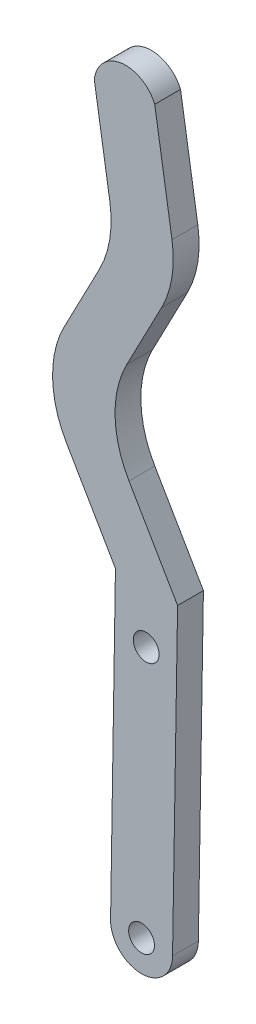
ISO-10303-21;
HEADER;
FILE_DESCRIPTION(('STEP AP214'),'2;1');
FILE_NAME('part.step','',(''),(''),'','','');
FILE_SCHEMA(('AUTOMOTIVE_DESIGN { 1 0 10303 214 1 1 1 1 }'));
ENDSEC;
DATA;
#1=APPLICATION_CONTEXT('core data for automotive mechanical design processes');
#2=APPLICATION_PROTOCOL_DEFINITION('international standard','automotive_design',2000,#1);
#3=PRODUCT_CONTEXT('',#1,'mechanical');
#4=PRODUCT('Part','Part','',(#3));
#5=PRODUCT_RELATED_PRODUCT_CATEGORY('part','',(#4));
#6=PRODUCT_DEFINITION_FORMATION('','',#4);
#7=PRODUCT_DEFINITION_CONTEXT('part definition',#1,'design');
#8=PRODUCT_DEFINITION('design','',#6,#7);
#9=PRODUCT_DEFINITION_SHAPE('','',#8);
#10=(LENGTH_UNIT() NAMED_UNIT(*) SI_UNIT(.MILLI.,.METRE.));
#11=(NAMED_UNIT(*) PLANE_ANGLE_UNIT() SI_UNIT($,.RADIAN.));
#12=(NAMED_UNIT(*) SI_UNIT($,.STERADIAN.) SOLID_ANGLE_UNIT());
#13=UNCERTAINTY_MEASURE_WITH_UNIT(LENGTH_MEASURE(1.E-05),#10,'distance_accuracy_value','');
#14=(GEOMETRIC_REPRESENTATION_CONTEXT(3) GLOBAL_UNCERTAINTY_ASSIGNED_CONTEXT((#13)) GLOBAL_UNIT_ASSIGNED_CONTEXT((#10,
#11,#12)) REPRESENTATION_CONTEXT('',''));
#15=CARTESIAN_POINT('',(0.,0.,0.));
#16=DIRECTION('',(0.,0.,1.));
#17=DIRECTION('',(1.,0.,0.));
#18=AXIS2_PLACEMENT_3D('',#15,#16,#17);
#19=CARTESIAN_POINT('',(2.76862014120037,85.7702329190452,5.));
#20=DIRECTION('',(0.,0.,1.));
#21=DIRECTION('',(1.,0.,0.));
#22=AXIS2_PLACEMENT_3D('',#19,#20,#21);
#23=PLANE('',#22);
#24=CARTESIAN_POINT('',(0.,-1.02524867935661E-13,5.));
#25=DIRECTION('',(0.,0.,1.));
#26=DIRECTION('',(1.,0.,0.));
#27=AXIS2_PLACEMENT_3D('',#24,#25,#26);
#28=CIRCLE('',#27,2.50000000000004);
#29=CARTESIAN_POINT('',(2.50000000000003,-1.02524867935661E-13,5.));
#30=VERTEX_POINT('',#29);
#31=EDGE_CURVE('E169',#30,#30,#28,.T.);
#32=ORIENTED_EDGE('',*,*,#31,.F.);
#33=EDGE_LOOP('',(#32));
#34=FACE_BOUND('',#33,.T.);
#35=DIRECTION('',(0.502736581634854,-0.864439662143114,0.));
#36=VECTOR('',#35,1.);
#37=CARTESIAN_POINT('',(-5.05699972133685,59.443873761078,5.));
#38=LINE('',#37,#36);
#39=CARTESIAN_POINT('',(-14.5201731016619,75.7155012863481,5.));
#40=VERTEX_POINT('',#39);
#41=CARTESIAN_POINT('',(-5.05699972133685,59.443873761078,5.));
#42=VERTEX_POINT('',#41);
#43=EDGE_CURVE('E192',#40,#42,#38,.T.);
#44=ORIENTED_EDGE('',*,*,#43,.T.);
#45=DIRECTION('',(-0.015859987864443,-0.999874222482478,0.));
#46=VECTOR('',#45,1.);
#47=CARTESIAN_POINT('',(-5.99677971324759,0.196552971949537,5.));
#48=LINE('',#47,#46);
#49=CARTESIAN_POINT('',(-5.99677971324759,0.196552971949537,5.));
#50=VERTEX_POINT('',#49);
#51=EDGE_CURVE('E110',#42,#50,#48,.T.);
#52=ORIENTED_EDGE('',*,*,#51,.T.);
#53=CARTESIAN_POINT('',(0.,-1.02524867935661E-13,5.));
#54=DIRECTION('',(0.,0.,1.));
#55=DIRECTION('',(1.,0.,0.));
#56=AXIS2_PLACEMENT_3D('',#53,#54,#55);
#57=CIRCLE('',#56,6.);
#58=CARTESIAN_POINT('',(6.,-2.19764419336077E-13,5.));
#59=VERTEX_POINT('',#58);
#60=EDGE_CURVE('E225',#50,#59,#57,.T.);
#61=ORIENTED_EDGE('',*,*,#60,.T.);
#62=DIRECTION('',(0.0164855294690928,0.999864104425258,0.));
#63=VECTOR('',#62,1.);
#64=CARTESIAN_POINT('',(6.,-2.20350539030523E-13,5.));
#65=LINE('',#64,#63);
#66=CARTESIAN_POINT('',(6.97682556944284,59.2454628164516,5.));
#67=VERTEX_POINT('',#66);
#68=EDGE_CURVE('E244',#59,#67,#65,.T.);
#69=ORIENTED_EDGE('',*,*,#68,.T.);
#70=DIRECTION('',(-0.502736581634854,0.864439662143115,0.));
#71=VECTOR('',#70,1.);
#72=CARTESIAN_POINT('',(6.97682556944284,59.2454628164516,5.));
#73=LINE('',#72,#71);
#74=CARTESIAN_POINT('',(-2.42733191045716,75.4156143662544,5.));
#75=VERTEX_POINT('',#74);
#76=EDGE_CURVE('E241',#67,#75,#73,.T.);
#77=ORIENTED_EDGE('',*,*,#76,.T.);
#78=CARTESIAN_POINT('',(14.8614613324051,85.4703459989515,5.));
#79=DIRECTION('',(0.,0.,-1.));
#80=DIRECTION('',(-1.,0.,0.));
#81=AXIS2_PLACEMENT_3D('',#78,#79,#80);
#82=CIRCLE('',#81,20.);
#83=CARTESIAN_POINT('',(-2.87016043985002,94.7218101709455,5.));
#84=VERTEX_POINT('',#83);
#85=EDGE_CURVE('E243',#75,#84,#82,.T.);
#86=ORIENTED_EDGE('',*,*,#85,.T.);
#87=DIRECTION('',(0.462573208599696,0.886581088612758,0.));
#88=VECTOR('',#87,1.);
#89=CARTESIAN_POINT('',(-2.87016043985003,94.7218101709455,5.));
#90=LINE('',#89,#88);
#91=CARTESIAN_POINT('',(3.87506989108864,107.649912228241,5.));
#92=VERTEX_POINT('',#91);
#93=EDGE_CURVE('E246',#84,#92,#90,.T.);
#94=ORIENTED_EDGE('',*,*,#93,.T.);
#95=CARTESIAN_POINT('',(-13.8565518811665,116.901376400235,5.));
#96=DIRECTION('',(0.,0.,1.));
#97=DIRECTION('',(1.,0.,0.));
#98=AXIS2_PLACEMENT_3D('',#95,#96,#97);
#99=CIRCLE('',#98,20.);
#100=CARTESIAN_POINT('',(5.89519305952556,120.042804705615,5.));
#101=VERTEX_POINT('',#100);
#102=EDGE_CURVE('E252',#92,#101,#99,.T.);
#103=ORIENTED_EDGE('',*,*,#102,.T.);
#104=DIRECTION('',(-0.157071415269026,0.987587247034602,0.));
#105=VECTOR('',#104,1.);
#106=CARTESIAN_POINT('',(5.89519305952556,120.042804705615,5.));
#107=LINE('',#106,#105);
#108=CARTESIAN_POINT('',(2.54991909479629,141.076230168453,5.));
#109=VERTEX_POINT('',#108);
#110=EDGE_CURVE('E254',#101,#109,#107,.T.);
#111=ORIENTED_EDGE('',*,*,#110,.T.);
#112=CARTESIAN_POINT('',(-3.08434296739014,138.697173938545,5.));
#113=DIRECTION('',(0.,0.,1.));
#114=DIRECTION('',(-1.,0.,0.));
#115=AXIS2_PLACEMENT_3D('',#112,#113,#114);
#116=CIRCLE('',#115,6.11594780311769);
#117=CARTESIAN_POINT('',(-9.15740247762038,139.42019932929,5.));
#118=VERTEX_POINT('',#117);
#119=EDGE_CURVE('E256',#109,#118,#116,.T.);
#120=ORIENTED_EDGE('',*,*,#119,.T.);
#121=DIRECTION('',(0.157071415269027,-0.987587247034602,0.));
#122=VECTOR('',#121,1.);
#123=CARTESIAN_POINT('',(-6.14059900752419,120.452033614517,5.));
#124=LINE('',#123,#122);
#125=CARTESIAN_POINT('',(-6.14059900752419,120.452033614517,5.));
#126=VERTEX_POINT('',#125);
#127=EDGE_CURVE('E147',#118,#126,#124,.T.);
#128=ORIENTED_EDGE('',*,*,#127,.T.);
#129=CARTESIAN_POINT('',(-25.8923439482162,117.310605309137,5.));
#130=DIRECTION('',(0.,0.,-1.));
#131=DIRECTION('',(1.,0.,0.));
#132=AXIS2_PLACEMENT_3D('',#129,#130,#131);
#133=CIRCLE('',#132,20.);
#134=CARTESIAN_POINT('',(-8.16072217596113,108.059141137143,5.));
#135=VERTEX_POINT('',#134);
#136=EDGE_CURVE('E141',#126,#135,#133,.T.);
#137=ORIENTED_EDGE('',*,*,#136,.T.);
#138=DIRECTION('',(-0.462573208599696,-0.886581088612757,0.));
#139=VECTOR('',#138,1.);
#140=CARTESIAN_POINT('',(-14.9630016310547,95.0216970910392,5.));
#141=LINE('',#140,#139);
#142=CARTESIAN_POINT('',(-14.9630016310547,95.0216970910392,5.));
#143=VERTEX_POINT('',#142);
#144=EDGE_CURVE('E145',#135,#143,#141,.T.);
#145=ORIENTED_EDGE('',*,*,#144,.T.);
#146=CARTESIAN_POINT('',(2.76862014120037,85.7702329190452,5.));
#147=DIRECTION('',(0.,0.,1.));
#148=DIRECTION('',(1.,0.,0.));
#149=AXIS2_PLACEMENT_3D('',#146,#147,#148);
#150=CIRCLE('',#149,20.);
#151=EDGE_CURVE('E49',#143,#40,#150,.T.);
#152=ORIENTED_EDGE('',*,*,#151,.T.);
#153=EDGE_LOOP('',(#44,#52,#61,#69,#77,#86,#94,#103,#111,#120,#128,#137,#145,#152));
#154=FACE_BOUND('',#153,.T.);
#155=CARTESIAN_POINT('',(0.896058218127778,49.2221551165477,5.));
#156=DIRECTION('',(0.,0.,1.));
#157=DIRECTION('',(1.,0.,0.));
#158=AXIS2_PLACEMENT_3D('',#155,#156,#157);
#159=CIRCLE('',#158,2.5);
#160=CARTESIAN_POINT('',(3.39605821812778,49.2221551165477,5.));
#161=VERTEX_POINT('',#160);
#162=EDGE_CURVE('E299',#161,#161,#159,.T.);
#163=ORIENTED_EDGE('',*,*,#162,.F.);
#164=EDGE_LOOP('',(#163));
#165=FACE_BOUND('',#164,.T.);
#166=ADVANCED_FACE('F32',(#34,#154,#165),#23,.T.);
#167=CARTESIAN_POINT('',(2.76862014120037,85.7702329190452,0.));
#168=DIRECTION('',(0.,0.,1.));
#169=DIRECTION('',(1.,0.,0.));
#170=AXIS2_PLACEMENT_3D('',#167,#168,#169);
#171=PLANE('',#170);
#172=CARTESIAN_POINT('',(0.,-1.02524867935661E-13,0.));
#173=DIRECTION('',(0.,0.,1.));
#174=DIRECTION('',(1.,0.,0.));
#175=AXIS2_PLACEMENT_3D('',#172,#173,#174);
#176=CIRCLE('',#175,2.50000000000004);
#177=CARTESIAN_POINT('',(2.50000000000003,-1.02524867935661E-13,0.));
#178=VERTEX_POINT('',#177);
#179=EDGE_CURVE('E304',#178,#178,#176,.T.);
#180=ORIENTED_EDGE('',*,*,#179,.T.);
#181=EDGE_LOOP('',(#180));
#182=FACE_BOUND('',#181,.T.);
#183=DIRECTION('',(0.502736581634854,-0.864439662143114,0.));
#184=VECTOR('',#183,1.);
#185=CARTESIAN_POINT('',(-5.05699972133685,59.443873761078,0.));
#186=LINE('',#185,#184);
#187=CARTESIAN_POINT('',(-14.5201731016619,75.7155012863481,0.));
#188=VERTEX_POINT('',#187);
#189=CARTESIAN_POINT('',(-5.05699972133685,59.443873761078,0.));
#190=VERTEX_POINT('',#189);
#191=EDGE_CURVE('E165',#188,#190,#186,.T.);
#192=ORIENTED_EDGE('',*,*,#191,.F.);
#193=CARTESIAN_POINT('',(2.76862014120037,85.7702329190452,0.));
#194=DIRECTION('',(0.,0.,1.));
#195=DIRECTION('',(1.,0.,0.));
#196=AXIS2_PLACEMENT_3D('',#193,#194,#195);
#197=CIRCLE('',#196,20.);
#198=CARTESIAN_POINT('',(-14.9630016310547,95.0216970910392,0.));
#199=VERTEX_POINT('',#198);
#200=EDGE_CURVE('E102',#199,#188,#197,.T.);
#201=ORIENTED_EDGE('',*,*,#200,.F.);
#202=DIRECTION('',(-0.462573208599696,-0.886581088612757,0.));
#203=VECTOR('',#202,1.);
#204=CARTESIAN_POINT('',(-14.9630016310547,95.0216970910392,0.));
#205=LINE('',#204,#203);
#206=CARTESIAN_POINT('',(-8.16072217596113,108.059141137143,0.));
#207=VERTEX_POINT('',#206);
#208=EDGE_CURVE('E96',#207,#199,#205,.T.);
#209=ORIENTED_EDGE('',*,*,#208,.F.);
#210=CARTESIAN_POINT('',(-25.8923439482162,117.310605309137,0.));
#211=DIRECTION('',(0.,0.,-1.));
#212=DIRECTION('',(1.,0.,0.));
#213=AXIS2_PLACEMENT_3D('',#210,#211,#212);
#214=CIRCLE('',#213,20.);
#215=CARTESIAN_POINT('',(-6.14059900752419,120.452033614517,0.));
#216=VERTEX_POINT('',#215);
#217=EDGE_CURVE('E155',#216,#207,#214,.T.);
#218=ORIENTED_EDGE('',*,*,#217,.F.);
#219=DIRECTION('',(0.157071415269027,-0.987587247034602,0.));
#220=VECTOR('',#219,1.);
#221=CARTESIAN_POINT('',(-6.14059900752419,120.452033614517,0.));
#222=LINE('',#221,#220);
#223=CARTESIAN_POINT('',(-9.15740247762038,139.42019932929,0.));
#224=VERTEX_POINT('',#223);
#225=EDGE_CURVE('E187',#224,#216,#222,.T.);
#226=ORIENTED_EDGE('',*,*,#225,.F.);
#227=CARTESIAN_POINT('',(-3.08434296739014,138.697173938545,0.));
#228=DIRECTION('',(0.,0.,1.));
#229=DIRECTION('',(-1.,0.,0.));
#230=AXIS2_PLACEMENT_3D('',#227,#228,#229);
#231=CIRCLE('',#230,6.11594780311769);
#232=CARTESIAN_POINT('',(2.54991909479629,141.076230168453,0.));
#233=VERTEX_POINT('',#232);
#234=EDGE_CURVE('E185',#233,#224,#231,.T.);
#235=ORIENTED_EDGE('',*,*,#234,.F.);
#236=DIRECTION('',(-0.157071415269026,0.987587247034602,0.));
#237=VECTOR('',#236,1.);
#238=CARTESIAN_POINT('',(5.89519305952556,120.042804705615,0.));
#239=LINE('',#238,#237);
#240=CARTESIAN_POINT('',(5.89519305952556,120.042804705615,0.));
#241=VERTEX_POINT('',#240);
#242=EDGE_CURVE('E183',#241,#233,#239,.T.);
#243=ORIENTED_EDGE('',*,*,#242,.F.);
#244=CARTESIAN_POINT('',(-13.8565518811665,116.901376400235,0.));
#245=DIRECTION('',(0.,0.,1.));
#246=DIRECTION('',(1.,0.,0.));
#247=AXIS2_PLACEMENT_3D('',#244,#245,#246);
#248=CIRCLE('',#247,20.);
#249=CARTESIAN_POINT('',(3.87506989108864,107.649912228241,0.));
#250=VERTEX_POINT('',#249);
#251=EDGE_CURVE('E181',#250,#241,#248,.T.);
#252=ORIENTED_EDGE('',*,*,#251,.F.);
#253=DIRECTION('',(0.462573208599696,0.886581088612758,0.));
#254=VECTOR('',#253,1.);
#255=CARTESIAN_POINT('',(-2.87016043985003,94.7218101709455,0.));
#256=LINE('',#255,#254);
#257=CARTESIAN_POINT('',(-2.87016043985002,94.7218101709455,0.));
#258=VERTEX_POINT('',#257);
#259=EDGE_CURVE('E179',#258,#250,#256,.T.);
#260=ORIENTED_EDGE('',*,*,#259,.F.);
#261=CARTESIAN_POINT('',(14.8614613324051,85.4703459989515,0.));
#262=DIRECTION('',(0.,0.,-1.));
#263=DIRECTION('',(-1.,0.,0.));
#264=AXIS2_PLACEMENT_3D('',#261,#262,#263);
#265=CIRCLE('',#264,20.);
#266=CARTESIAN_POINT('',(-2.42733191045716,75.4156143662544,0.));
#267=VERTEX_POINT('',#266);
#268=EDGE_CURVE('E177',#267,#258,#265,.T.);
#269=ORIENTED_EDGE('',*,*,#268,.F.);
#270=DIRECTION('',(-0.502736581634854,0.864439662143115,0.));
#271=VECTOR('',#270,1.);
#272=CARTESIAN_POINT('',(6.97682556944284,59.2454628164516,0.));
#273=LINE('',#272,#271);
#274=CARTESIAN_POINT('',(6.97682556944284,59.2454628164516,0.));
#275=VERTEX_POINT('',#274);
#276=EDGE_CURVE('E175',#275,#267,#273,.T.);
#277=ORIENTED_EDGE('',*,*,#276,.F.);
#278=DIRECTION('',(0.0164855294690928,0.999864104425258,0.));
#279=VECTOR('',#278,1.);
#280=CARTESIAN_POINT('',(6.,-2.20350539030523E-13,0.));
#281=LINE('',#280,#279);
#282=CARTESIAN_POINT('',(6.,-2.19764419336077E-13,0.));
#283=VERTEX_POINT('',#282);
#284=EDGE_CURVE('E173',#283,#275,#281,.T.);
#285=ORIENTED_EDGE('',*,*,#284,.F.);
#286=CARTESIAN_POINT('',(0.,-1.02524867935661E-13,0.));
#287=DIRECTION('',(0.,0.,1.));
#288=DIRECTION('',(1.,0.,0.));
#289=AXIS2_PLACEMENT_3D('',#286,#287,#288);
#290=CIRCLE('',#289,6.);
#291=CARTESIAN_POINT('',(-5.99677971324759,0.196552971949537,0.));
#292=VERTEX_POINT('',#291);
#293=EDGE_CURVE('E171',#292,#283,#290,.T.);
#294=ORIENTED_EDGE('',*,*,#293,.F.);
#295=DIRECTION('',(-0.015859987864443,-0.999874222482478,0.));
#296=VECTOR('',#295,1.);
#297=CARTESIAN_POINT('',(-5.99677971324759,0.196552971949537,0.));
#298=LINE('',#297,#296);
#299=EDGE_CURVE('E168',#190,#292,#298,.T.);
#300=ORIENTED_EDGE('',*,*,#299,.F.);
#301=EDGE_LOOP('',(#192,#201,#209,#218,#226,#235,#243,#252,#260,#269,#277,#285,#294,#300));
#302=FACE_BOUND('',#301,.T.);
#303=CARTESIAN_POINT('',(0.896058218127778,49.2221551165477,0.));
#304=DIRECTION('',(0.,0.,1.));
#305=DIRECTION('',(1.,0.,0.));
#306=AXIS2_PLACEMENT_3D('',#303,#304,#305);
#307=CIRCLE('',#306,2.5);
#308=CARTESIAN_POINT('',(3.39605821812778,49.2221551165477,0.));
#309=VERTEX_POINT('',#308);
#310=EDGE_CURVE('E302',#309,#309,#307,.T.);
#311=ORIENTED_EDGE('',*,*,#310,.T.);
#312=EDGE_LOOP('',(#311));
#313=FACE_BOUND('',#312,.T.);
#314=ADVANCED_FACE('F229',(#182,#302,#313),#171,.F.);
#315=CARTESIAN_POINT('',(-5.05699972133685,59.443873761078,5.));
#316=DIRECTION('',(0.864439662143115,0.502736581634854,0.));
#317=DIRECTION('',(-0.502736581634854,0.864439662143115,0.));
#318=AXIS2_PLACEMENT_3D('',#315,#316,#317);
#319=PLANE('',#318);
#320=ORIENTED_EDGE('',*,*,#191,.T.);
#321=DIRECTION('',(0.,0.,-1.));
#322=VECTOR('',#321,1.);
#323=CARTESIAN_POINT('',(-5.05699972133685,59.443873761078,5.));
#324=LINE('',#323,#322);
#325=EDGE_CURVE('E11',#42,#190,#324,.T.);
#326=ORIENTED_EDGE('',*,*,#325,.F.);
#327=ORIENTED_EDGE('',*,*,#43,.F.);
#328=DIRECTION('',(0.,0.,-1.));
#329=VECTOR('',#328,1.);
#330=CARTESIAN_POINT('',(-14.5201731016619,75.7155012863481,5.));
#331=LINE('',#330,#329);
#332=EDGE_CURVE('E161',#40,#188,#331,.T.);
#333=ORIENTED_EDGE('',*,*,#332,.T.);
#334=EDGE_LOOP('',(#320,#326,#327,#333));
#335=FACE_BOUND('',#334,.T.);
#336=ADVANCED_FACE('F34',(#335),#319,.F.);
#337=CARTESIAN_POINT('',(-5.99677971324759,0.196552971949537,5.));
#338=DIRECTION('',(0.999874222482478,-0.015859987864443,0.));
#339=DIRECTION('',(0.015859987864443,0.999874222482478,0.));
#340=AXIS2_PLACEMENT_3D('',#337,#338,#339);
#341=PLANE('',#340);
#342=ORIENTED_EDGE('',*,*,#299,.T.);
#343=DIRECTION('',(0.,0.,-1.));
#344=VECTOR('',#343,1.);
#345=CARTESIAN_POINT('',(-5.99677971324759,0.196552971949537,5.));
#346=LINE('',#345,#344);
#347=EDGE_CURVE('E41',#50,#292,#346,.T.);
#348=ORIENTED_EDGE('',*,*,#347,.F.);
#349=ORIENTED_EDGE('',*,*,#51,.F.);
#350=ORIENTED_EDGE('',*,*,#325,.T.);
#351=EDGE_LOOP('',(#342,#348,#349,#350));
#352=FACE_BOUND('',#351,.T.);
#353=ADVANCED_FACE('F417',(#352),#341,.F.);
#354=CARTESIAN_POINT('',(0.,-1.02524867935661E-13,5.));
#355=DIRECTION('',(0.,0.,-1.));
#356=DIRECTION('',(-1.,0.,0.));
#357=AXIS2_PLACEMENT_3D('',#354,#355,#356);
#358=CYLINDRICAL_SURFACE('',#357,6.);
#359=ORIENTED_EDGE('',*,*,#293,.T.);
#360=DIRECTION('',(0.,0.,-1.));
#361=VECTOR('',#360,1.);
#362=CARTESIAN_POINT('',(6.,-2.19764419336077E-13,5.));
#363=LINE('',#362,#361);
#364=EDGE_CURVE('E217',#59,#283,#363,.T.);
#365=ORIENTED_EDGE('',*,*,#364,.F.);
#366=ORIENTED_EDGE('',*,*,#60,.F.);
#367=ORIENTED_EDGE('',*,*,#347,.T.);
#368=EDGE_LOOP('',(#359,#365,#366,#367));
#369=FACE_BOUND('',#368,.T.);
#370=ADVANCED_FACE('F223',(#369),#358,.T.);
#371=CARTESIAN_POINT('',(6.,-2.20350539030523E-13,5.));
#372=DIRECTION('',(-0.999864104425258,0.0164855294690928,0.));
#373=DIRECTION('',(-0.0164855294690928,-0.999864104425258,0.));
#374=AXIS2_PLACEMENT_3D('',#371,#372,#373);
#375=PLANE('',#374);
#376=ORIENTED_EDGE('',*,*,#284,.T.);
#377=DIRECTION('',(0.,0.,-1.));
#378=VECTOR('',#377,1.);
#379=CARTESIAN_POINT('',(6.97682556944284,59.2454628164516,5.));
#380=LINE('',#379,#378);
#381=EDGE_CURVE('E214',#67,#275,#380,.T.);
#382=ORIENTED_EDGE('',*,*,#381,.F.);
#383=ORIENTED_EDGE('',*,*,#68,.F.);
#384=ORIENTED_EDGE('',*,*,#364,.T.);
#385=EDGE_LOOP('',(#376,#382,#383,#384));
#386=FACE_BOUND('',#385,.T.);
#387=ADVANCED_FACE('F235',(#386),#375,.F.);
#388=CARTESIAN_POINT('',(6.97682556944284,59.2454628164516,5.));
#389=DIRECTION('',(-0.864439662143115,-0.502736581634854,0.));
#390=DIRECTION('',(0.502736581634854,-0.864439662143115,0.));
#391=AXIS2_PLACEMENT_3D('',#388,#389,#390);
#392=PLANE('',#391);
#393=ORIENTED_EDGE('',*,*,#276,.T.);
#394=DIRECTION('',(0.,0.,-1.));
#395=VECTOR('',#394,1.);
#396=CARTESIAN_POINT('',(-2.42733191045716,75.4156143662544,5.));
#397=LINE('',#396,#395);
#398=EDGE_CURVE('E211',#75,#267,#397,.T.);
#399=ORIENTED_EDGE('',*,*,#398,.F.);
#400=ORIENTED_EDGE('',*,*,#76,.F.);
#401=ORIENTED_EDGE('',*,*,#381,.T.);
#402=EDGE_LOOP('',(#393,#399,#400,#401));
#403=FACE_BOUND('',#402,.T.);
#404=ADVANCED_FACE('F239',(#403),#392,.F.);
#405=CARTESIAN_POINT('',(14.8614613324051,85.4703459989515,5.));
#406=DIRECTION('',(0.,0.,-1.));
#407=DIRECTION('',(-1.,0.,0.));
#408=AXIS2_PLACEMENT_3D('',#405,#406,#407);
#409=CYLINDRICAL_SURFACE('',#408,20.);
#410=ORIENTED_EDGE('',*,*,#268,.T.);
#411=DIRECTION('',(0.,0.,-1.));
#412=VECTOR('',#411,1.);
#413=CARTESIAN_POINT('',(-2.87016043985002,94.7218101709455,5.));
#414=LINE('',#413,#412);
#415=EDGE_CURVE('E208',#84,#258,#414,.T.);
#416=ORIENTED_EDGE('',*,*,#415,.F.);
#417=ORIENTED_EDGE('',*,*,#85,.F.);
#418=ORIENTED_EDGE('',*,*,#398,.T.);
#419=EDGE_LOOP('',(#410,#416,#417,#418));
#420=FACE_BOUND('',#419,.T.);
#421=ADVANCED_FACE('F382',(#420),#409,.F.);
#422=CARTESIAN_POINT('',(-2.87016043985003,94.7218101709455,5.));
#423=DIRECTION('',(-0.886581088612758,0.462573208599696,0.));
#424=DIRECTION('',(-0.462573208599696,-0.886581088612758,0.));
#425=AXIS2_PLACEMENT_3D('',#422,#423,#424);
#426=PLANE('',#425);
#427=ORIENTED_EDGE('',*,*,#259,.T.);
#428=DIRECTION('',(0.,0.,-1.));
#429=VECTOR('',#428,1.);
#430=CARTESIAN_POINT('',(3.87506989108864,107.649912228241,5.));
#431=LINE('',#430,#429);
#432=EDGE_CURVE('E205',#92,#250,#431,.T.);
#433=ORIENTED_EDGE('',*,*,#432,.F.);
#434=ORIENTED_EDGE('',*,*,#93,.F.);
#435=ORIENTED_EDGE('',*,*,#415,.T.);
#436=EDGE_LOOP('',(#427,#433,#434,#435));
#437=FACE_BOUND('',#436,.T.);
#438=ADVANCED_FACE('F372',(#437),#426,.F.);
#439=CARTESIAN_POINT('',(-13.8565518811665,116.901376400235,5.));
#440=DIRECTION('',(0.,0.,-1.));
#441=DIRECTION('',(-1.,0.,0.));
#442=AXIS2_PLACEMENT_3D('',#439,#440,#441);
#443=CYLINDRICAL_SURFACE('',#442,20.);
#444=ORIENTED_EDGE('',*,*,#251,.T.);
#445=DIRECTION('',(0.,0.,-1.));
#446=VECTOR('',#445,1.);
#447=CARTESIAN_POINT('',(5.89519305952556,120.042804705615,5.));
#448=LINE('',#447,#446);
#449=EDGE_CURVE('E202',#101,#241,#448,.T.);
#450=ORIENTED_EDGE('',*,*,#449,.F.);
#451=ORIENTED_EDGE('',*,*,#102,.F.);
#452=ORIENTED_EDGE('',*,*,#432,.T.);
#453=EDGE_LOOP('',(#444,#450,#451,#452));
#454=FACE_BOUND('',#453,.T.);
#455=ADVANCED_FACE('F362',(#454),#443,.T.);
#456=CARTESIAN_POINT('',(5.89519305952556,120.042804705615,5.));
#457=DIRECTION('',(-0.987587247034603,-0.157071415269026,0.));
#458=DIRECTION('',(0.157071415269026,-0.987587247034603,0.));
#459=AXIS2_PLACEMENT_3D('',#456,#457,#458);
#460=PLANE('',#459);
#461=ORIENTED_EDGE('',*,*,#242,.T.);
#462=DIRECTION('',(0.,0.,-1.));
#463=VECTOR('',#462,1.);
#464=CARTESIAN_POINT('',(2.54991909479629,141.076230168453,5.));
#465=LINE('',#464,#463);
#466=EDGE_CURVE('E199',#109,#233,#465,.T.);
#467=ORIENTED_EDGE('',*,*,#466,.F.);
#468=ORIENTED_EDGE('',*,*,#110,.F.);
#469=ORIENTED_EDGE('',*,*,#449,.T.);
#470=EDGE_LOOP('',(#461,#467,#468,#469));
#471=FACE_BOUND('',#470,.T.);
#472=ADVANCED_FACE('F353',(#471),#460,.F.);
#473=CARTESIAN_POINT('',(-3.08434296739014,138.697173938545,5.));
#474=DIRECTION('',(0.,0.,-1.));
#475=DIRECTION('',(-1.,0.,0.));
#476=AXIS2_PLACEMENT_3D('',#473,#474,#475);
#477=CYLINDRICAL_SURFACE('',#476,6.11594780311769);
#478=ORIENTED_EDGE('',*,*,#234,.T.);
#479=DIRECTION('',(0.,0.,-1.));
#480=VECTOR('',#479,1.);
#481=CARTESIAN_POINT('',(-9.15740247762038,139.42019932929,5.));
#482=LINE('',#481,#480);
#483=EDGE_CURVE('E196',#118,#224,#482,.T.);
#484=ORIENTED_EDGE('',*,*,#483,.F.);
#485=ORIENTED_EDGE('',*,*,#119,.F.);
#486=ORIENTED_EDGE('',*,*,#466,.T.);
#487=EDGE_LOOP('',(#478,#484,#485,#486));
#488=FACE_BOUND('',#487,.T.);
#489=ADVANCED_FACE('F262',(#488),#477,.T.);
#490=CARTESIAN_POINT('',(-6.14059900752419,120.452033614517,5.));
#491=DIRECTION('',(0.987587247034603,0.157071415269027,0.));
#492=DIRECTION('',(-0.157071415269027,0.987587247034603,0.));
#493=AXIS2_PLACEMENT_3D('',#490,#491,#492);
#494=PLANE('',#493);
#495=ORIENTED_EDGE('',*,*,#225,.T.);
#496=DIRECTION('',(0.,0.,-1.));
#497=VECTOR('',#496,1.);
#498=CARTESIAN_POINT('',(-6.14059900752419,120.452033614517,5.));
#499=LINE('',#498,#497);
#500=EDGE_CURVE('E156',#126,#216,#499,.T.);
#501=ORIENTED_EDGE('',*,*,#500,.F.);
#502=ORIENTED_EDGE('',*,*,#127,.F.);
#503=ORIENTED_EDGE('',*,*,#483,.T.);
#504=EDGE_LOOP('',(#495,#501,#502,#503));
#505=FACE_BOUND('',#504,.T.);
#506=ADVANCED_FACE('F266',(#505),#494,.F.);
#507=CARTESIAN_POINT('',(-25.8923439482162,117.310605309137,5.));
#508=DIRECTION('',(0.,0.,-1.));
#509=DIRECTION('',(-1.,0.,0.));
#510=AXIS2_PLACEMENT_3D('',#507,#508,#509);
#511=CYLINDRICAL_SURFACE('',#510,20.);
#512=ORIENTED_EDGE('',*,*,#217,.T.);
#513=DIRECTION('',(0.,0.,-1.));
#514=VECTOR('',#513,1.);
#515=CARTESIAN_POINT('',(-8.16072217596113,108.059141137143,5.));
#516=LINE('',#515,#514);
#517=EDGE_CURVE('E152',#135,#207,#516,.T.);
#518=ORIENTED_EDGE('',*,*,#517,.F.);
#519=ORIENTED_EDGE('',*,*,#136,.F.);
#520=ORIENTED_EDGE('',*,*,#500,.T.);
#521=EDGE_LOOP('',(#512,#518,#519,#520));
#522=FACE_BOUND('',#521,.T.);
#523=ADVANCED_FACE('F153',(#522),#511,.F.);
#524=CARTESIAN_POINT('',(-14.9630016310547,95.0216970910392,5.));
#525=DIRECTION('',(0.886581088612757,-0.462573208599696,0.));
#526=DIRECTION('',(0.462573208599696,0.886581088612757,0.));
#527=AXIS2_PLACEMENT_3D('',#524,#525,#526);
#528=PLANE('',#527);
#529=ORIENTED_EDGE('',*,*,#208,.T.);
#530=DIRECTION('',(0.,0.,-1.));
#531=VECTOR('',#530,1.);
#532=CARTESIAN_POINT('',(-14.9630016310547,95.0216970910392,5.));
#533=LINE('',#532,#531);
#534=EDGE_CURVE('E157',#143,#199,#533,.T.);
#535=ORIENTED_EDGE('',*,*,#534,.F.);
#536=ORIENTED_EDGE('',*,*,#144,.F.);
#537=ORIENTED_EDGE('',*,*,#517,.T.);
#538=EDGE_LOOP('',(#529,#535,#536,#537));
#539=FACE_BOUND('',#538,.T.);
#540=ADVANCED_FACE('F159',(#539),#528,.F.);
#541=CARTESIAN_POINT('',(2.76862014120037,85.7702329190452,5.));
#542=DIRECTION('',(0.,0.,-1.));
#543=DIRECTION('',(-1.,0.,0.));
#544=AXIS2_PLACEMENT_3D('',#541,#542,#543);
#545=CYLINDRICAL_SURFACE('',#544,20.);
#546=ORIENTED_EDGE('',*,*,#200,.T.);
#547=ORIENTED_EDGE('',*,*,#332,.F.);
#548=ORIENTED_EDGE('',*,*,#151,.F.);
#549=ORIENTED_EDGE('',*,*,#534,.T.);
#550=EDGE_LOOP('',(#546,#547,#548,#549));
#551=FACE_BOUND('',#550,.T.);
#552=ADVANCED_FACE('F270',(#551),#545,.T.);
#553=CARTESIAN_POINT('',(0.,-1.02524867935661E-13,5.));
#554=DIRECTION('',(0.,0.,-1.));
#555=DIRECTION('',(-1.,0.,0.));
#556=AXIS2_PLACEMENT_3D('',#553,#554,#555);
#557=CYLINDRICAL_SURFACE('',#556,2.50000000000004);
#558=ORIENTED_EDGE('',*,*,#31,.T.);
#559=EDGE_LOOP('',(#558));
#560=FACE_BOUND('',#559,.T.);
#561=ORIENTED_EDGE('',*,*,#179,.F.);
#562=EDGE_LOOP('',(#561));
#563=FACE_BOUND('',#562,.T.);
#564=ADVANCED_FACE('F272',(#560,#563),#557,.F.);
#565=CARTESIAN_POINT('',(0.896058218127778,49.2221551165477,5.));
#566=DIRECTION('',(0.,0.,-1.));
#567=DIRECTION('',(-1.,0.,0.));
#568=AXIS2_PLACEMENT_3D('',#565,#566,#567);
#569=CYLINDRICAL_SURFACE('',#568,2.5);
#570=ORIENTED_EDGE('',*,*,#162,.T.);
#571=EDGE_LOOP('',(#570));
#572=FACE_BOUND('',#571,.T.);
#573=ORIENTED_EDGE('',*,*,#310,.F.);
#574=EDGE_LOOP('',(#573));
#575=FACE_BOUND('',#574,.T.);
#576=ADVANCED_FACE('F278',(#572,#575),#569,.F.);
#577=CLOSED_SHELL('',(#166,#314,#336,#353,#370,#387,#404,#421,#438,#455,#472,#489,#506,#523,
#540,#552,#564,#576));
#578=MANIFOLD_SOLID_BREP('B2',#577);
#579=ADVANCED_BREP_SHAPE_REPRESENTATION('',(#18,#578),#14);
#580=SHAPE_DEFINITION_REPRESENTATION(#9,#579);
ENDSEC;
END-ISO-10303-21;
